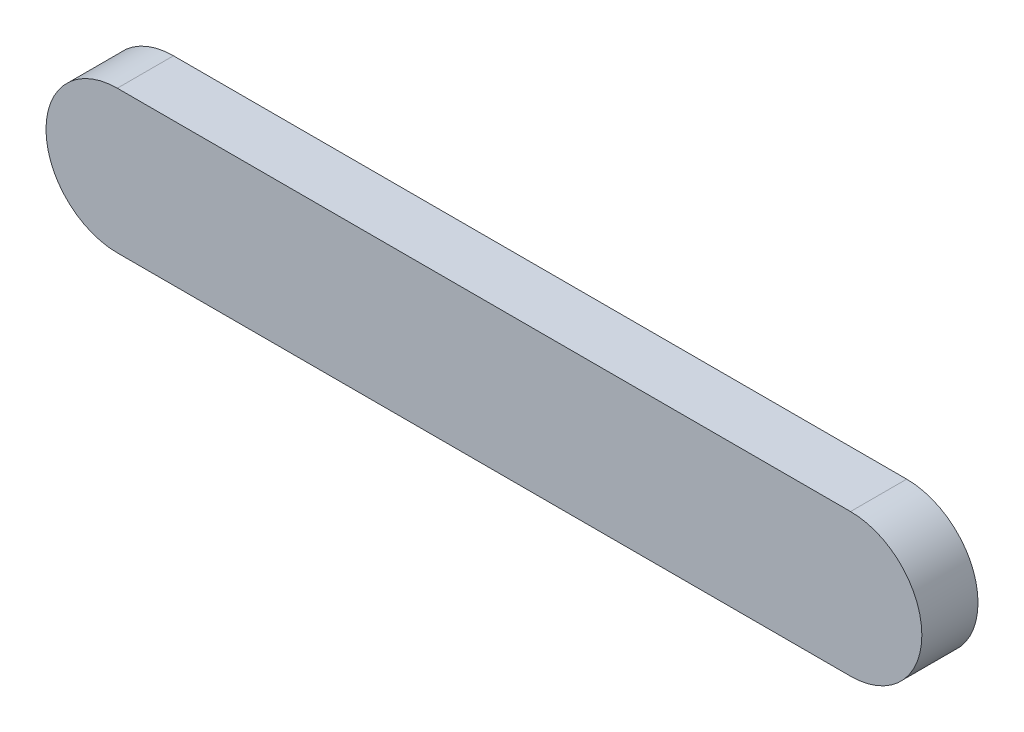
ISO-10303-21;
HEADER;
FILE_DESCRIPTION(('STEP AP214'),'2;1');
FILE_NAME('part.step','',(''),(''),'','','');
FILE_SCHEMA(('AUTOMOTIVE_DESIGN { 1 0 10303 214 1 1 1 1 }'));
ENDSEC;
DATA;
#1=APPLICATION_CONTEXT('core data for automotive mechanical design processes');
#2=APPLICATION_PROTOCOL_DEFINITION('international standard','automotive_design',2000,#1);
#3=PRODUCT_CONTEXT('',#1,'mechanical');
#4=PRODUCT('Part','Part','',(#3));
#5=PRODUCT_RELATED_PRODUCT_CATEGORY('part','',(#4));
#6=PRODUCT_DEFINITION_FORMATION('','',#4);
#7=PRODUCT_DEFINITION_CONTEXT('part definition',#1,'design');
#8=PRODUCT_DEFINITION('design','',#6,#7);
#9=PRODUCT_DEFINITION_SHAPE('','',#8);
#10=(LENGTH_UNIT() NAMED_UNIT(*) SI_UNIT(.MILLI.,.METRE.));
#11=(NAMED_UNIT(*) PLANE_ANGLE_UNIT() SI_UNIT($,.RADIAN.));
#12=(NAMED_UNIT(*) SI_UNIT($,.STERADIAN.) SOLID_ANGLE_UNIT());
#13=UNCERTAINTY_MEASURE_WITH_UNIT(LENGTH_MEASURE(1.E-05),#10,'distance_accuracy_value','');
#14=(GEOMETRIC_REPRESENTATION_CONTEXT(3) GLOBAL_UNCERTAINTY_ASSIGNED_CONTEXT((#13)) GLOBAL_UNIT_ASSIGNED_CONTEXT((#10,
#11,#12)) REPRESENTATION_CONTEXT('',''));
#15=CARTESIAN_POINT('',(0.,0.,0.));
#16=DIRECTION('',(0.,0.,1.));
#17=DIRECTION('',(1.,0.,0.));
#18=AXIS2_PLACEMENT_3D('',#15,#16,#17);
#19=CARTESIAN_POINT('',(138.5062,107.7468,0.));
#20=DIRECTION('',(0.,1.,0.));
#21=DIRECTION('',(1.,0.,0.));
#22=AXIS2_PLACEMENT_3D('',#19,#20,#21);
#23=PLANE('',#22);
#24=DIRECTION('',(1.,0.,0.));
#25=VECTOR('',#24,1.);
#26=CARTESIAN_POINT('',(138.5062,107.7468,0.1999996));
#27=LINE('',#26,#25);
#28=CARTESIAN_POINT('',(138.5062,107.7468,0.1999996));
#29=VERTEX_POINT('',#28);
#30=CARTESIAN_POINT('',(141.117828,107.7468,0.1999996));
#31=VERTEX_POINT('',#30);
#32=EDGE_CURVE('E11',#29,#31,#27,.T.);
#33=ORIENTED_EDGE('',*,*,#32,.F.);
#34=DIRECTION('',(0.,0.,1.));
#35=VECTOR('',#34,1.);
#36=CARTESIAN_POINT('',(138.5062,107.7468,0.));
#37=LINE('',#36,#35);
#38=CARTESIAN_POINT('',(138.5062,107.7468,0.));
#39=VERTEX_POINT('',#38);
#40=EDGE_CURVE('E24',#39,#29,#37,.T.);
#41=ORIENTED_EDGE('',*,*,#40,.F.);
#42=DIRECTION('',(1.,0.,0.));
#43=VECTOR('',#42,1.);
#44=CARTESIAN_POINT('',(138.5062,107.7468,0.));
#45=LINE('',#44,#43);
#46=CARTESIAN_POINT('',(141.117828,107.7468,0.));
#47=VERTEX_POINT('',#46);
#48=EDGE_CURVE('E75',#39,#47,#45,.T.);
#49=ORIENTED_EDGE('',*,*,#48,.T.);
#50=DIRECTION('',(0.,0.,1.));
#51=VECTOR('',#50,1.);
#52=CARTESIAN_POINT('',(141.117828,107.7468,0.));
#53=LINE('',#52,#51);
#54=EDGE_CURVE('E37',#47,#31,#53,.T.);
#55=ORIENTED_EDGE('',*,*,#54,.T.);
#56=EDGE_LOOP('',(#33,#41,#49,#55));
#57=FACE_BOUND('',#56,.T.);
#58=ADVANCED_FACE('F17',(#57),#23,.F.);
#59=CARTESIAN_POINT('',(141.117828,108.0008,0.));
#60=DIRECTION('',(0.,0.,-1.));
#61=DIRECTION('',(1.11896493820486E-13,-1.,0.));
#62=AXIS2_PLACEMENT_3D('',#59,#60,#61);
#63=CYLINDRICAL_SURFACE('',#62,0.25400000000001);
#64=CARTESIAN_POINT('',(141.117828,108.0008,0.1999996));
#65=DIRECTION('',(0.,0.,1.));
#66=DIRECTION('',(1.11896493820486E-13,-1.,0.));
#67=AXIS2_PLACEMENT_3D('',#64,#65,#66);
#68=CIRCLE('',#67,0.25400000000001);
#69=CARTESIAN_POINT('',(141.117828,108.2548,0.1999996));
#70=VERTEX_POINT('',#69);
#71=EDGE_CURVE('E83',#31,#70,#68,.T.);
#72=ORIENTED_EDGE('',*,*,#71,.F.);
#73=ORIENTED_EDGE('',*,*,#54,.F.);
#74=CARTESIAN_POINT('',(141.117828,108.0008,0.));
#75=DIRECTION('',(0.,0.,1.));
#76=DIRECTION('',(1.11896493820486E-13,-1.,0.));
#77=AXIS2_PLACEMENT_3D('',#74,#75,#76);
#78=CIRCLE('',#77,0.25400000000001);
#79=CARTESIAN_POINT('',(141.117828,108.2548,0.));
#80=VERTEX_POINT('',#79);
#81=EDGE_CURVE('E81',#47,#80,#78,.T.);
#82=ORIENTED_EDGE('',*,*,#81,.T.);
#83=DIRECTION('',(0.,0.,1.));
#84=VECTOR('',#83,1.);
#85=CARTESIAN_POINT('',(141.117828,108.2548,0.));
#86=LINE('',#85,#84);
#87=EDGE_CURVE('E67',#80,#70,#86,.T.);
#88=ORIENTED_EDGE('',*,*,#87,.T.);
#89=EDGE_LOOP('',(#72,#73,#82,#88));
#90=FACE_BOUND('',#89,.T.);
#91=ADVANCED_FACE('F89',(#90),#63,.T.);
#92=CARTESIAN_POINT('',(141.117828,108.2548,0.));
#93=DIRECTION('',(0.,-1.,0.));
#94=DIRECTION('',(-1.,0.,0.));
#95=AXIS2_PLACEMENT_3D('',#92,#93,#94);
#96=PLANE('',#95);
#97=DIRECTION('',(-1.,0.,0.));
#98=VECTOR('',#97,1.);
#99=CARTESIAN_POINT('',(141.117828,108.2548,0.1999996));
#100=LINE('',#99,#98);
#101=CARTESIAN_POINT('',(138.5062,108.2548,0.1999996));
#102=VERTEX_POINT('',#101);
#103=EDGE_CURVE('E71',#70,#102,#100,.T.);
#104=ORIENTED_EDGE('',*,*,#103,.F.);
#105=ORIENTED_EDGE('',*,*,#87,.F.);
#106=DIRECTION('',(-1.,0.,0.));
#107=VECTOR('',#106,1.);
#108=CARTESIAN_POINT('',(141.117828,108.2548,0.));
#109=LINE('',#108,#107);
#110=CARTESIAN_POINT('',(138.5062,108.2548,0.));
#111=VERTEX_POINT('',#110);
#112=EDGE_CURVE('E63',#80,#111,#109,.T.);
#113=ORIENTED_EDGE('',*,*,#112,.T.);
#114=DIRECTION('',(0.,0.,1.));
#115=VECTOR('',#114,1.);
#116=CARTESIAN_POINT('',(138.5062,108.2548,0.));
#117=LINE('',#116,#115);
#118=EDGE_CURVE('E53',#111,#102,#117,.T.);
#119=ORIENTED_EDGE('',*,*,#118,.T.);
#120=EDGE_LOOP('',(#104,#105,#113,#119));
#121=FACE_BOUND('',#120,.T.);
#122=ADVANCED_FACE('F66',(#121),#96,.F.);
#123=CARTESIAN_POINT('',(138.5062,108.0008,0.));
#124=DIRECTION('',(0.,0.,-1.));
#125=DIRECTION('',(0.,1.,0.));
#126=AXIS2_PLACEMENT_3D('',#123,#124,#125);
#127=CYLINDRICAL_SURFACE('',#126,0.25400000000001);
#128=CARTESIAN_POINT('',(138.5062,108.0008,0.1999996));
#129=DIRECTION('',(0.,0.,1.));
#130=DIRECTION('',(0.,1.,0.));
#131=AXIS2_PLACEMENT_3D('',#128,#129,#130);
#132=CIRCLE('',#131,0.25400000000001);
#133=EDGE_CURVE('E59',#102,#29,#132,.T.);
#134=ORIENTED_EDGE('',*,*,#133,.F.);
#135=ORIENTED_EDGE('',*,*,#118,.F.);
#136=CARTESIAN_POINT('',(138.5062,108.0008,0.));
#137=DIRECTION('',(0.,0.,1.));
#138=DIRECTION('',(0.,1.,0.));
#139=AXIS2_PLACEMENT_3D('',#136,#137,#138);
#140=CIRCLE('',#139,0.25400000000001);
#141=EDGE_CURVE('E57',#111,#39,#140,.T.);
#142=ORIENTED_EDGE('',*,*,#141,.T.);
#143=ORIENTED_EDGE('',*,*,#40,.T.);
#144=EDGE_LOOP('',(#134,#135,#142,#143));
#145=FACE_BOUND('',#144,.T.);
#146=ADVANCED_FACE('F55',(#145),#127,.T.);
#147=CARTESIAN_POINT('',(138.5062,107.7468,0.));
#148=DIRECTION('',(0.,0.,-1.));
#149=DIRECTION('',(-1.,0.,0.));
#150=AXIS2_PLACEMENT_3D('',#147,#148,#149);
#151=PLANE('',#150);
#152=ORIENTED_EDGE('',*,*,#141,.F.);
#153=ORIENTED_EDGE('',*,*,#112,.F.);
#154=ORIENTED_EDGE('',*,*,#81,.F.);
#155=ORIENTED_EDGE('',*,*,#48,.F.);
#156=EDGE_LOOP('',(#152,#153,#154,#155));
#157=FACE_BOUND('',#156,.T.);
#158=ADVANCED_FACE('F74',(#157),#151,.T.);
#159=CARTESIAN_POINT('',(138.5062,107.7468,0.1999996));
#160=DIRECTION('',(0.,0.,-1.));
#161=DIRECTION('',(-1.,0.,0.));
#162=AXIS2_PLACEMENT_3D('',#159,#160,#161);
#163=PLANE('',#162);
#164=ORIENTED_EDGE('',*,*,#32,.T.);
#165=ORIENTED_EDGE('',*,*,#71,.T.);
#166=ORIENTED_EDGE('',*,*,#103,.T.);
#167=ORIENTED_EDGE('',*,*,#133,.T.);
#168=EDGE_LOOP('',(#164,#165,#166,#167));
#169=FACE_BOUND('',#168,.T.);
#170=ADVANCED_FACE('F91',(#169),#163,.F.);
#171=CLOSED_SHELL('',(#58,#91,#122,#146,#158,#170));
#172=MANIFOLD_SOLID_BREP('B1',#171);
#173=ADVANCED_BREP_SHAPE_REPRESENTATION('',(#18,#172),#14);
#174=SHAPE_DEFINITION_REPRESENTATION(#9,#173);
ENDSEC;
END-ISO-10303-21;
